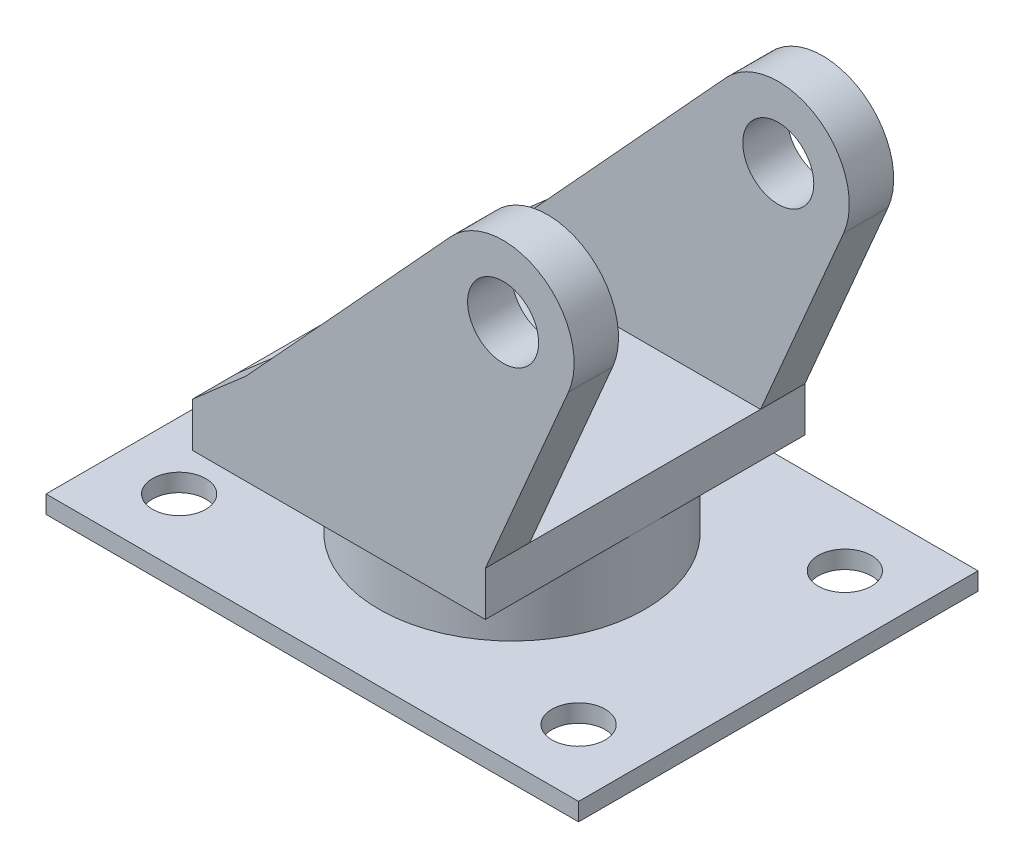
ISO-10303-21;
HEADER;
FILE_DESCRIPTION(('STEP AP214'),'2;1');
FILE_NAME('part.step','',(''),(''),'','','');
FILE_SCHEMA(('AUTOMOTIVE_DESIGN { 1 0 10303 214 1 1 1 1 }'));
ENDSEC;
DATA;
#1=APPLICATION_CONTEXT('core data for automotive mechanical design processes');
#2=APPLICATION_PROTOCOL_DEFINITION('international standard','automotive_design',2000,#1);
#3=PRODUCT_CONTEXT('',#1,'mechanical');
#4=PRODUCT('Part','Part','',(#3));
#5=PRODUCT_RELATED_PRODUCT_CATEGORY('part','',(#4));
#6=PRODUCT_DEFINITION_FORMATION('','',#4);
#7=PRODUCT_DEFINITION_CONTEXT('part definition',#1,'design');
#8=PRODUCT_DEFINITION('design','',#6,#7);
#9=PRODUCT_DEFINITION_SHAPE('','',#8);
#10=(LENGTH_UNIT() NAMED_UNIT(*) SI_UNIT(.MILLI.,.METRE.));
#11=(NAMED_UNIT(*) PLANE_ANGLE_UNIT() SI_UNIT($,.RADIAN.));
#12=(NAMED_UNIT(*) SI_UNIT($,.STERADIAN.) SOLID_ANGLE_UNIT());
#13=UNCERTAINTY_MEASURE_WITH_UNIT(LENGTH_MEASURE(1.E-05),#10,'distance_accuracy_value','');
#14=(GEOMETRIC_REPRESENTATION_CONTEXT(3) GLOBAL_UNCERTAINTY_ASSIGNED_CONTEXT((#13)) GLOBAL_UNIT_ASSIGNED_CONTEXT((#10,
#11,#12)) REPRESENTATION_CONTEXT('',''));
#15=CARTESIAN_POINT('',(0.,0.,0.));
#16=DIRECTION('',(0.,0.,1.));
#17=DIRECTION('',(1.,0.,0.));
#18=AXIS2_PLACEMENT_3D('',#15,#16,#17);
#19=CARTESIAN_POINT('',(17.0000000000009,39.9999999999992,18.));
#20=DIRECTION('',(0.,0.,-1.));
#21=DIRECTION('',(-1.,0.,0.));
#22=AXIS2_PLACEMENT_3D('',#19,#20,#21);
#23=PLANE('',#22);
#24=DIRECTION('',(-0.753353489502776,-0.65761578437108,0.));
#25=VECTOR('',#24,1.);
#26=CARTESIAN_POINT('',(-18.,14.9999999999906,18.));
#27=LINE('',#26,#25);
#28=CARTESIAN_POINT('',(-11.94409655582,20.2863068254206,18.));
#29=VERTEX_POINT('',#28);
#30=CARTESIAN_POINT('',(-18.,14.99999999999,18.));
#31=VERTEX_POINT('',#30);
#32=EDGE_CURVE('E277',#29,#31,#27,.T.);
#33=ORIENTED_EDGE('',*,*,#32,.T.);
#34=DIRECTION('',(0.,1.,0.));
#35=VECTOR('',#34,1.);
#36=CARTESIAN_POINT('',(-18.,10.,18.));
#37=LINE('',#36,#35);
#38=CARTESIAN_POINT('',(-18.,10.,18.));
#39=VERTEX_POINT('',#38);
#40=EDGE_CURVE('E175',#39,#31,#37,.T.);
#41=ORIENTED_EDGE('',*,*,#40,.F.);
#42=DIRECTION('',(-1.,0.,0.));
#43=VECTOR('',#42,1.);
#44=CARTESIAN_POINT('',(-18.,10.,18.));
#45=LINE('',#44,#43);
#46=CARTESIAN_POINT('',(15.,10.,18.));
#47=VERTEX_POINT('',#46);
#48=EDGE_CURVE('E172',#47,#39,#45,.T.);
#49=ORIENTED_EDGE('',*,*,#48,.F.);
#50=DIRECTION('',(0.,1.,0.));
#51=VECTOR('',#50,1.);
#52=CARTESIAN_POINT('',(15.,10.,18.));
#53=LINE('',#52,#51);
#54=CARTESIAN_POINT('',(15.0000000000003,14.9999999999906,18.));
#55=VERTEX_POINT('',#54);
#56=EDGE_CURVE('E252',#47,#55,#53,.T.);
#57=ORIENTED_EDGE('',*,*,#56,.T.);
#58=DIRECTION('',(-0.393544447211318,-0.919305590143527,0.));
#59=VECTOR('',#58,1.);
#60=CARTESIAN_POINT('',(24.35444472114,36.8516444222906,18.));
#61=LINE('',#60,#59);
#62=CARTESIAN_POINT('',(24.3544447211403,36.8516444222907,18.));
#63=VERTEX_POINT('',#62);
#64=EDGE_CURVE('E254',#63,#55,#61,.T.);
#65=ORIENTED_EDGE('',*,*,#64,.F.);
#66=CARTESIAN_POINT('',(17.0000000000009,39.9999999999992,18.));
#67=DIRECTION('',(0.,0.,1.));
#68=DIRECTION('',(-1.,0.,0.));
#69=AXIS2_PLACEMENT_3D('',#66,#67,#68);
#70=CIRCLE('',#69,7.99999999999895);
#71=CARTESIAN_POINT('',(11.1051828217126,45.4084314208956,18.));
#72=VERTEX_POINT('',#71);
#73=EDGE_CURVE('E273',#63,#72,#70,.T.);
#74=ORIENTED_EDGE('',*,*,#73,.T.);
#75=DIRECTION('',(-0.676053927612154,-0.73685214728613,0.));
#76=VECTOR('',#75,1.);
#77=CARTESIAN_POINT('',(-11.94409655582,20.2863068254206,18.));
#78=LINE('',#77,#76);
#79=EDGE_CURVE('E69',#72,#29,#78,.T.);
#80=ORIENTED_EDGE('',*,*,#79,.T.);
#81=EDGE_LOOP('',(#33,#41,#49,#57,#65,#74,#80));
#82=FACE_BOUND('',#81,.T.);
#83=CARTESIAN_POINT('',(17.,40.,18.));
#84=DIRECTION('',(0.,0.,1.));
#85=DIRECTION('',(1.,0.,0.));
#86=AXIS2_PLACEMENT_3D('',#83,#84,#85);
#87=CIRCLE('',#86,3.99999999999999);
#88=CARTESIAN_POINT('',(21.,40.,18.));
#89=VERTEX_POINT('',#88);
#90=EDGE_CURVE('E196',#89,#89,#87,.T.);
#91=ORIENTED_EDGE('',*,*,#90,.F.);
#92=EDGE_LOOP('',(#91));
#93=FACE_BOUND('',#92,.T.);
#94=ADVANCED_FACE('F49',(#82,#93),#23,.F.);
#95=CARTESIAN_POINT('',(14.9999999999994,0.,0.));
#96=DIRECTION('',(1.,0.,0.));
#97=DIRECTION('',(0.,0.,-1.));
#98=AXIS2_PLACEMENT_3D('',#95,#96,#97);
#99=PLANE('',#98);
#100=DIRECTION('',(0.,0.,-1.));
#101=VECTOR('',#100,1.);
#102=CARTESIAN_POINT('',(14.9999999999997,14.9999999999887,-13.));
#103=LINE('',#102,#101);
#104=CARTESIAN_POINT('',(15.,15.000000000001,-13.));
#105=VERTEX_POINT('',#104);
#106=CARTESIAN_POINT('',(15.,15.,-18.));
#107=VERTEX_POINT('',#106);
#108=EDGE_CURVE('E306',#105,#107,#103,.T.);
#109=ORIENTED_EDGE('',*,*,#108,.F.);
#110=DIRECTION('',(0.,0.,-1.));
#111=VECTOR('',#110,1.);
#112=CARTESIAN_POINT('',(15.,15.000000000001,13.));
#113=LINE('',#112,#111);
#114=CARTESIAN_POINT('',(15.,15.000000000001,13.));
#115=VERTEX_POINT('',#114);
#116=EDGE_CURVE('E210',#115,#105,#113,.T.);
#117=ORIENTED_EDGE('',*,*,#116,.F.);
#118=DIRECTION('',(0.,0.,1.));
#119=VECTOR('',#118,1.);
#120=CARTESIAN_POINT('',(15.0000000000003,14.9999999999906,13.));
#121=LINE('',#120,#119);
#122=EDGE_CURVE('E315',#115,#55,#121,.T.);
#123=ORIENTED_EDGE('',*,*,#122,.T.);
#124=ORIENTED_EDGE('',*,*,#56,.F.);
#125=DIRECTION('',(0.,0.,1.));
#126=VECTOR('',#125,1.);
#127=CARTESIAN_POINT('',(15.,10.,18.));
#128=LINE('',#127,#126);
#129=CARTESIAN_POINT('',(15.,10.,0.));
#130=VERTEX_POINT('',#129);
#131=EDGE_CURVE('E246',#130,#47,#128,.T.);
#132=ORIENTED_EDGE('',*,*,#131,.F.);
#133=CARTESIAN_POINT('',(15.,10.,-18.));
#134=VERTEX_POINT('',#133);
#135=EDGE_CURVE('E248',#134,#130,#128,.T.);
#136=ORIENTED_EDGE('',*,*,#135,.F.);
#137=DIRECTION('',(0.,-1.,0.));
#138=VECTOR('',#137,1.);
#139=CARTESIAN_POINT('',(15.,10.,-18.));
#140=LINE('',#139,#138);
#141=EDGE_CURVE('E192',#107,#134,#140,.T.);
#142=ORIENTED_EDGE('',*,*,#141,.F.);
#143=EDGE_LOOP('',(#109,#117,#123,#124,#132,#136,#142));
#144=FACE_BOUND('',#143,.T.);
#145=ADVANCED_FACE('F347',(#144),#99,.T.);
#146=CARTESIAN_POINT('',(-17.9999999999996,0.,0.));
#147=DIRECTION('',(1.,0.,0.));
#148=DIRECTION('',(0.,0.,-1.));
#149=AXIS2_PLACEMENT_3D('',#146,#147,#148);
#150=PLANE('',#149);
#151=DIRECTION('',(0.,0.,1.));
#152=VECTOR('',#151,1.);
#153=CARTESIAN_POINT('',(-18.,15.000000000001,-13.));
#154=LINE('',#153,#152);
#155=CARTESIAN_POINT('',(-18.,15.000000000001,-13.));
#156=VERTEX_POINT('',#155);
#157=CARTESIAN_POINT('',(-18.,15.000000000001,13.));
#158=VERTEX_POINT('',#157);
#159=EDGE_CURVE('E326',#156,#158,#154,.T.);
#160=ORIENTED_EDGE('',*,*,#159,.F.);
#161=DIRECTION('',(0.,0.,1.));
#162=VECTOR('',#161,1.);
#163=CARTESIAN_POINT('',(-18.0000000000012,14.9999999999887,-15.));
#164=LINE('',#163,#162);
#165=CARTESIAN_POINT('',(-18.0000000000005,15.,-18.));
#166=VERTEX_POINT('',#165);
#167=EDGE_CURVE('E182',#166,#156,#164,.T.);
#168=ORIENTED_EDGE('',*,*,#167,.F.);
#169=DIRECTION('',(0.,1.,0.));
#170=VECTOR('',#169,1.);
#171=CARTESIAN_POINT('',(-18.0000000000005,15.,-18.));
#172=LINE('',#171,#170);
#173=CARTESIAN_POINT('',(-18.,10.,-18.));
#174=VERTEX_POINT('',#173);
#175=EDGE_CURVE('E178',#174,#166,#172,.T.);
#176=ORIENTED_EDGE('',*,*,#175,.F.);
#177=DIRECTION('',(0.,0.,-1.));
#178=VECTOR('',#177,1.);
#179=CARTESIAN_POINT('',(-18.,10.,-15.));
#180=LINE('',#179,#178);
#181=EDGE_CURVE('E165',#39,#174,#180,.T.);
#182=ORIENTED_EDGE('',*,*,#181,.F.);
#183=ORIENTED_EDGE('',*,*,#40,.T.);
#184=DIRECTION('',(0.,0.,-1.));
#185=VECTOR('',#184,1.);
#186=CARTESIAN_POINT('',(-18.,14.9999999999906,18.));
#187=LINE('',#186,#185);
#188=EDGE_CURVE('E279',#31,#158,#187,.T.);
#189=ORIENTED_EDGE('',*,*,#188,.T.);
#190=EDGE_LOOP('',(#160,#168,#176,#182,#183,#189));
#191=FACE_BOUND('',#190,.T.);
#192=ADVANCED_FACE('F180',(#191),#150,.F.);
#193=CARTESIAN_POINT('',(17.0000000000009,39.9999999999992,13.));
#194=DIRECTION('',(0.,0.,-1.));
#195=DIRECTION('',(-1.,0.,0.));
#196=AXIS2_PLACEMENT_3D('',#193,#194,#195);
#197=PLANE('',#196);
#198=CARTESIAN_POINT('',(17.,40.,13.));
#199=DIRECTION('',(0.,0.,-1.));
#200=DIRECTION('',(-1.,0.,0.));
#201=AXIS2_PLACEMENT_3D('',#198,#199,#200);
#202=CIRCLE('',#201,3.99999999999999);
#203=CARTESIAN_POINT('',(13.,40.,13.));
#204=VERTEX_POINT('',#203);
#205=EDGE_CURVE('E193',#204,#204,#202,.T.);
#206=ORIENTED_EDGE('',*,*,#205,.F.);
#207=EDGE_LOOP('',(#206));
#208=FACE_BOUND('',#207,.T.);
#209=DIRECTION('',(-0.393544447211318,-0.919305590143527,0.));
#210=VECTOR('',#209,1.);
#211=CARTESIAN_POINT('',(24.35444472114,36.8516444222906,13.));
#212=LINE('',#211,#210);
#213=CARTESIAN_POINT('',(24.35444472114,36.8516444222906,13.));
#214=VERTEX_POINT('',#213);
#215=EDGE_CURVE('E257',#214,#115,#212,.T.);
#216=ORIENTED_EDGE('',*,*,#215,.T.);
#217=DIRECTION('',(1.,0.,0.));
#218=VECTOR('',#217,1.);
#219=CARTESIAN_POINT('',(-18.,15.000000000001,13.));
#220=LINE('',#219,#218);
#221=EDGE_CURVE('E229',#158,#115,#220,.T.);
#222=ORIENTED_EDGE('',*,*,#221,.F.);
#223=DIRECTION('',(-0.753353489502776,-0.65761578437108,0.));
#224=VECTOR('',#223,1.);
#225=CARTESIAN_POINT('',(-18.,14.9999999999906,13.));
#226=LINE('',#225,#224);
#227=CARTESIAN_POINT('',(-11.944096555808,20.286306825431,13.));
#228=VERTEX_POINT('',#227);
#229=EDGE_CURVE('E275',#228,#158,#226,.T.);
#230=ORIENTED_EDGE('',*,*,#229,.F.);
#231=DIRECTION('',(-0.676053927612154,-0.73685214728613,0.));
#232=VECTOR('',#231,1.);
#233=CARTESIAN_POINT('',(-11.94409655582,20.2863068254206,13.));
#234=LINE('',#233,#232);
#235=CARTESIAN_POINT('',(11.105182821735,45.40843142092,13.));
#236=VERTEX_POINT('',#235);
#237=EDGE_CURVE('E272',#236,#228,#234,.T.);
#238=ORIENTED_EDGE('',*,*,#237,.F.);
#239=CARTESIAN_POINT('',(17.0000000000009,39.9999999999992,13.));
#240=DIRECTION('',(0.,0.,1.));
#241=DIRECTION('',(-1.,0.,0.));
#242=AXIS2_PLACEMENT_3D('',#239,#240,#241);
#243=CIRCLE('',#242,7.99999999999895);
#244=EDGE_CURVE('E262',#214,#236,#243,.T.);
#245=ORIENTED_EDGE('',*,*,#244,.F.);
#246=EDGE_LOOP('',(#216,#222,#230,#238,#245));
#247=FACE_BOUND('',#246,.T.);
#248=ADVANCED_FACE('F381',(#208,#247),#197,.T.);
#249=CARTESIAN_POINT('',(17.0000000000009,39.9999999999992,18.));
#250=DIRECTION('',(0.,0.,-1.));
#251=DIRECTION('',(-1.,0.,0.));
#252=AXIS2_PLACEMENT_3D('',#249,#250,#251);
#253=CYLINDRICAL_SURFACE('',#252,7.99999999999895);
#254=DIRECTION('',(0.,0.,-1.));
#255=VECTOR('',#254,1.);
#256=CARTESIAN_POINT('',(24.3544447211403,36.8516444222907,18.));
#257=LINE('',#256,#255);
#258=EDGE_CURVE('E282',#63,#214,#257,.T.);
#259=ORIENTED_EDGE('',*,*,#258,.T.);
#260=ORIENTED_EDGE('',*,*,#244,.T.);
#261=DIRECTION('',(0.,0.,-1.));
#262=VECTOR('',#261,1.);
#263=CARTESIAN_POINT('',(11.1051828217126,45.4084314208956,18.));
#264=LINE('',#263,#262);
#265=EDGE_CURVE('E288',#72,#236,#264,.T.);
#266=ORIENTED_EDGE('',*,*,#265,.F.);
#267=ORIENTED_EDGE('',*,*,#73,.F.);
#268=EDGE_LOOP('',(#259,#260,#266,#267));
#269=FACE_BOUND('',#268,.T.);
#270=ADVANCED_FACE('F51',(#269),#253,.T.);
#271=CARTESIAN_POINT('',(-11.94409655582,20.2863068254206,18.));
#272=DIRECTION('',(0.73685214728613,-0.676053927612154,0.));
#273=DIRECTION('',(0.676053927612154,0.73685214728613,0.));
#274=AXIS2_PLACEMENT_3D('',#271,#272,#273);
#275=PLANE('',#274);
#276=ORIENTED_EDGE('',*,*,#237,.T.);
#277=DIRECTION('',(0.,0.,-1.));
#278=VECTOR('',#277,1.);
#279=CARTESIAN_POINT('',(-11.94409655582,20.2863068254206,18.));
#280=LINE('',#279,#278);
#281=EDGE_CURVE('E285',#29,#228,#280,.T.);
#282=ORIENTED_EDGE('',*,*,#281,.F.);
#283=ORIENTED_EDGE('',*,*,#79,.F.);
#284=ORIENTED_EDGE('',*,*,#265,.T.);
#285=EDGE_LOOP('',(#276,#282,#283,#284));
#286=FACE_BOUND('',#285,.T.);
#287=ADVANCED_FACE('F387',(#286),#275,.F.);
#288=CARTESIAN_POINT('',(-18.,14.9999999999906,18.));
#289=DIRECTION('',(0.65761578437108,-0.753353489502776,0.));
#290=DIRECTION('',(0.753353489502776,0.65761578437108,0.));
#291=AXIS2_PLACEMENT_3D('',#288,#289,#290);
#292=PLANE('',#291);
#293=ORIENTED_EDGE('',*,*,#229,.T.);
#294=ORIENTED_EDGE('',*,*,#188,.F.);
#295=ORIENTED_EDGE('',*,*,#32,.F.);
#296=ORIENTED_EDGE('',*,*,#281,.T.);
#297=EDGE_LOOP('',(#293,#294,#295,#296));
#298=FACE_BOUND('',#297,.T.);
#299=ADVANCED_FACE('F385',(#298),#292,.F.);
#300=CARTESIAN_POINT('',(16.9999999999952,40.0000000000021,-13.));
#301=DIRECTION('',(0.,0.,1.));
#302=DIRECTION('',(1.,0.,0.));
#303=AXIS2_PLACEMENT_3D('',#300,#301,#302);
#304=PLANE('',#303);
#305=CARTESIAN_POINT('',(17.,40.,-13.));
#306=DIRECTION('',(0.,0.,1.));
#307=DIRECTION('',(1.,0.,0.));
#308=AXIS2_PLACEMENT_3D('',#305,#306,#307);
#309=CIRCLE('',#308,3.99999999999999);
#310=CARTESIAN_POINT('',(21.,40.,-13.));
#311=VERTEX_POINT('',#310);
#312=EDGE_CURVE('E421',#311,#311,#309,.T.);
#313=ORIENTED_EDGE('',*,*,#312,.F.);
#314=EDGE_LOOP('',(#313));
#315=FACE_BOUND('',#314,.T.);
#316=CARTESIAN_POINT('',(16.9999999999952,40.0000000000021,-13.));
#317=DIRECTION('',(0.,0.,-1.));
#318=DIRECTION('',(1.,0.,0.));
#319=AXIS2_PLACEMENT_3D('',#316,#317,#318);
#320=CIRCLE('',#319,8.00000000000141);
#321=CARTESIAN_POINT('',(11.1051828217232,45.40843142092,-13.));
#322=VERTEX_POINT('',#321);
#323=CARTESIAN_POINT('',(24.35444472114,36.851644422289,-13.));
#324=VERTEX_POINT('',#323);
#325=EDGE_CURVE('E58',#322,#324,#320,.T.);
#326=ORIENTED_EDGE('',*,*,#325,.F.);
#327=DIRECTION('',(0.676053927612209,0.736852147286079,0.));
#328=VECTOR('',#327,1.);
#329=CARTESIAN_POINT('',(11.1051828217055,45.4084314209007,-13.));
#330=LINE('',#329,#328);
#331=CARTESIAN_POINT('',(-11.9440965558257,20.286306825431,-13.));
#332=VERTEX_POINT('',#331);
#333=EDGE_CURVE('E258',#332,#322,#330,.T.);
#334=ORIENTED_EDGE('',*,*,#333,.F.);
#335=DIRECTION('',(0.75335348950278,0.657615784371076,0.));
#336=VECTOR('',#335,1.);
#337=CARTESIAN_POINT('',(-11.9440965559012,20.2863068253487,-13.));
#338=LINE('',#337,#336);
#339=EDGE_CURVE('E260',#156,#332,#338,.T.);
#340=ORIENTED_EDGE('',*,*,#339,.F.);
#341=DIRECTION('',(-1.,0.,0.));
#342=VECTOR('',#341,1.);
#343=CARTESIAN_POINT('',(15.,15.000000000001,-13.));
#344=LINE('',#343,#342);
#345=EDGE_CURVE('E328',#105,#156,#344,.T.);
#346=ORIENTED_EDGE('',*,*,#345,.F.);
#347=DIRECTION('',(0.393544447211335,0.919305590143519,0.));
#348=VECTOR('',#347,1.);
#349=CARTESIAN_POINT('',(14.9999999999997,14.9999999999887,-13.));
#350=LINE('',#349,#348);
#351=EDGE_CURVE('E310',#105,#324,#350,.T.);
#352=ORIENTED_EDGE('',*,*,#351,.T.);
#353=EDGE_LOOP('',(#326,#334,#340,#346,#352));
#354=FACE_BOUND('',#353,.T.);
#355=ADVANCED_FACE('F353',(#315,#354),#304,.T.);
#356=CARTESIAN_POINT('',(-11.9440965559012,20.2863068253487,-15.));
#357=DIRECTION('',(0.657615784371076,-0.75335348950278,0.));
#358=DIRECTION('',(0.75335348950278,0.657615784371076,0.));
#359=AXIS2_PLACEMENT_3D('',#356,#357,#358);
#360=PLANE('',#359);
#361=ORIENTED_EDGE('',*,*,#339,.T.);
#362=DIRECTION('',(0.,0.,1.));
#363=VECTOR('',#362,1.);
#364=CARTESIAN_POINT('',(-11.9440965559012,20.2863068253487,-15.));
#365=LINE('',#364,#363);
#366=CARTESIAN_POINT('',(-11.9440965559005,20.28630682536,-18.));
#367=VERTEX_POINT('',#366);
#368=EDGE_CURVE('E269',#367,#332,#365,.T.);
#369=ORIENTED_EDGE('',*,*,#368,.F.);
#370=DIRECTION('',(0.75335348950278,0.657615784371075,0.));
#371=VECTOR('',#370,1.);
#372=CARTESIAN_POINT('',(-11.9440965559005,20.28630682536,-18.));
#373=LINE('',#372,#371);
#374=EDGE_CURVE('E186',#166,#367,#373,.T.);
#375=ORIENTED_EDGE('',*,*,#374,.F.);
#376=ORIENTED_EDGE('',*,*,#167,.T.);
#377=EDGE_LOOP('',(#361,#369,#375,#376));
#378=FACE_BOUND('',#377,.T.);
#379=ADVANCED_FACE('F355',(#378),#360,.F.);
#380=CARTESIAN_POINT('',(11.1051828217055,45.4084314209007,-15.));
#381=DIRECTION('',(0.736852147286079,-0.676053927612209,0.));
#382=DIRECTION('',(0.676053927612209,0.736852147286079,0.));
#383=AXIS2_PLACEMENT_3D('',#380,#381,#382);
#384=PLANE('',#383);
#385=ORIENTED_EDGE('',*,*,#333,.T.);
#386=DIRECTION('',(0.,0.,1.));
#387=VECTOR('',#386,1.);
#388=CARTESIAN_POINT('',(11.1051828217055,45.4084314209007,-15.));
#389=LINE('',#388,#387);
#390=CARTESIAN_POINT('',(11.1051828217119,45.4084314209107,-18.));
#391=VERTEX_POINT('',#390);
#392=EDGE_CURVE('E266',#391,#322,#389,.T.);
#393=ORIENTED_EDGE('',*,*,#392,.F.);
#394=DIRECTION('',(0.676053927612319,0.736852147285978,0.));
#395=VECTOR('',#394,1.);
#396=CARTESIAN_POINT('',(11.1051828217119,45.4084314209107,-18.));
#397=LINE('',#396,#395);
#398=EDGE_CURVE('E201',#367,#391,#397,.T.);
#399=ORIENTED_EDGE('',*,*,#398,.F.);
#400=ORIENTED_EDGE('',*,*,#368,.T.);
#401=EDGE_LOOP('',(#385,#393,#399,#400));
#402=FACE_BOUND('',#401,.T.);
#403=ADVANCED_FACE('F359',(#402),#384,.F.);
#404=CARTESIAN_POINT('',(16.9999999999952,40.0000000000021,-15.));
#405=DIRECTION('',(0.,0.,1.));
#406=DIRECTION('',(1.,0.,0.));
#407=AXIS2_PLACEMENT_3D('',#404,#405,#406);
#408=CYLINDRICAL_SURFACE('',#407,8.00000000000141);
#409=ORIENTED_EDGE('',*,*,#392,.T.);
#410=ORIENTED_EDGE('',*,*,#325,.T.);
#411=DIRECTION('',(0.,0.,1.));
#412=VECTOR('',#411,1.);
#413=CARTESIAN_POINT('',(24.3544447211397,36.8516444222993,-15.));
#414=LINE('',#413,#412);
#415=CARTESIAN_POINT('',(24.3544447211489,36.8516444223209,-18.));
#416=VERTEX_POINT('',#415);
#417=EDGE_CURVE('E263',#416,#324,#414,.T.);
#418=ORIENTED_EDGE('',*,*,#417,.F.);
#419=CARTESIAN_POINT('',(17.0000000000002,40.0000000000117,-18.));
#420=DIRECTION('',(0.,0.,-1.));
#421=DIRECTION('',(1.,0.,0.));
#422=AXIS2_PLACEMENT_3D('',#419,#420,#421);
#423=CIRCLE('',#422,8.00000000000061);
#424=EDGE_CURVE('E204',#391,#416,#423,.T.);
#425=ORIENTED_EDGE('',*,*,#424,.F.);
#426=EDGE_LOOP('',(#409,#410,#418,#425));
#427=FACE_BOUND('',#426,.T.);
#428=ADVANCED_FACE('F361',(#427),#408,.T.);
#429=CARTESIAN_POINT('',(14.9999999999997,14.9999999999887,-13.));
#430=DIRECTION('',(-0.91930559014352,0.393544447211335,0.));
#431=DIRECTION('',(-0.393544447211335,-0.91930559014352,0.));
#432=AXIS2_PLACEMENT_3D('',#429,#430,#431);
#433=PLANE('',#432);
#434=ORIENTED_EDGE('',*,*,#108,.T.);
#435=DIRECTION('',(-0.393544447211328,-0.919305590143522,0.));
#436=VECTOR('',#435,1.);
#437=CARTESIAN_POINT('',(15.,15.,-18.));
#438=LINE('',#437,#436);
#439=EDGE_CURVE('E207',#416,#107,#438,.T.);
#440=ORIENTED_EDGE('',*,*,#439,.F.);
#441=ORIENTED_EDGE('',*,*,#417,.T.);
#442=ORIENTED_EDGE('',*,*,#351,.F.);
#443=EDGE_LOOP('',(#434,#440,#441,#442));
#444=FACE_BOUND('',#443,.T.);
#445=ADVANCED_FACE('F350',(#444),#433,.F.);
#446=CARTESIAN_POINT('',(24.35444472114,36.8516444222906,13.));
#447=DIRECTION('',(-0.919305590143527,0.393544447211318,0.));
#448=DIRECTION('',(-0.393544447211318,-0.919305590143527,0.));
#449=AXIS2_PLACEMENT_3D('',#446,#447,#448);
#450=PLANE('',#449);
#451=ORIENTED_EDGE('',*,*,#64,.T.);
#452=ORIENTED_EDGE('',*,*,#122,.F.);
#453=ORIENTED_EDGE('',*,*,#215,.F.);
#454=ORIENTED_EDGE('',*,*,#258,.F.);
#455=EDGE_LOOP('',(#451,#452,#453,#454));
#456=FACE_BOUND('',#455,.T.);
#457=ADVANCED_FACE('F368',(#456),#450,.F.);
#458=CARTESIAN_POINT('',(0.,10.,0.));
#459=DIRECTION('',(0.,1.,0.));
#460=DIRECTION('',(0.,0.,1.));
#461=AXIS2_PLACEMENT_3D('',#458,#459,#460);
#462=PLANE('',#461);
#463=CARTESIAN_POINT('',(0.,10.,0.));
#464=DIRECTION('',(0.,-1.,0.));
#465=DIRECTION('',(0.,0.,-1.));
#466=AXIS2_PLACEMENT_3D('',#463,#464,#465);
#467=CIRCLE('',#466,15.);
#468=EDGE_CURVE('E12',#130,#130,#467,.T.);
#469=ORIENTED_EDGE('',*,*,#468,.F.);
#470=ORIENTED_EDGE('',*,*,#131,.T.);
#471=ORIENTED_EDGE('',*,*,#48,.T.);
#472=ORIENTED_EDGE('',*,*,#181,.T.);
#473=DIRECTION('',(-1.,0.,0.));
#474=VECTOR('',#473,1.);
#475=CARTESIAN_POINT('',(-18.,10.,-18.));
#476=LINE('',#475,#474);
#477=EDGE_CURVE('E170',#134,#174,#476,.T.);
#478=ORIENTED_EDGE('',*,*,#477,.F.);
#479=ORIENTED_EDGE('',*,*,#135,.T.);
#480=EDGE_LOOP('',(#469,#470,#471,#472,#478,#479));
#481=FACE_BOUND('',#480,.T.);
#482=ADVANCED_FACE('F167',(#481),#462,.F.);
#483=CARTESIAN_POINT('',(0.,2.,0.));
#484=DIRECTION('',(0.,1.,0.));
#485=DIRECTION('',(0.,0.,1.));
#486=AXIS2_PLACEMENT_3D('',#483,#484,#485);
#487=CYLINDRICAL_SURFACE('',#486,15.);
#488=CARTESIAN_POINT('',(0.,2.,0.));
#489=DIRECTION('',(0.,-1.,0.));
#490=DIRECTION('',(0.,0.,-1.));
#491=AXIS2_PLACEMENT_3D('',#488,#489,#490);
#492=CIRCLE('',#491,15.);
#493=CARTESIAN_POINT('',(0.,2.,-15.));
#494=VERTEX_POINT('',#493);
#495=EDGE_CURVE('E239',#494,#494,#492,.T.);
#496=ORIENTED_EDGE('',*,*,#495,.F.);
#497=EDGE_LOOP('',(#496));
#498=FACE_BOUND('',#497,.T.);
#499=ORIENTED_EDGE('',*,*,#468,.T.);
#500=EDGE_LOOP('',(#499));
#501=FACE_BOUND('',#500,.T.);
#502=ADVANCED_FACE('F411',(#498,#501),#487,.T.);
#503=CARTESIAN_POINT('',(-30.,0.,-22.5));
#504=DIRECTION('',(-1.,0.,0.));
#505=DIRECTION('',(0.,0.,1.));
#506=AXIS2_PLACEMENT_3D('',#503,#504,#505);
#507=PLANE('',#506);
#508=DIRECTION('',(0.,0.,1.));
#509=VECTOR('',#508,1.);
#510=CARTESIAN_POINT('',(-30.,2.,-22.5));
#511=LINE('',#510,#509);
#512=CARTESIAN_POINT('',(-30.,2.,-22.5));
#513=VERTEX_POINT('',#512);
#514=CARTESIAN_POINT('',(-30.,2.,22.5));
#515=VERTEX_POINT('',#514);
#516=EDGE_CURVE('E225',#513,#515,#511,.T.);
#517=ORIENTED_EDGE('',*,*,#516,.F.);
#518=DIRECTION('',(0.,1.,0.));
#519=VECTOR('',#518,1.);
#520=CARTESIAN_POINT('',(-30.,0.,-22.5));
#521=LINE('',#520,#519);
#522=CARTESIAN_POINT('',(-30.,0.,-22.5));
#523=VERTEX_POINT('',#522);
#524=EDGE_CURVE('E237',#523,#513,#521,.T.);
#525=ORIENTED_EDGE('',*,*,#524,.F.);
#526=DIRECTION('',(0.,0.,1.));
#527=VECTOR('',#526,1.);
#528=CARTESIAN_POINT('',(-30.,0.,-22.5));
#529=LINE('',#528,#527);
#530=CARTESIAN_POINT('',(-30.,0.,22.5));
#531=VERTEX_POINT('',#530);
#532=EDGE_CURVE('E211',#523,#531,#529,.T.);
#533=ORIENTED_EDGE('',*,*,#532,.T.);
#534=DIRECTION('',(0.,1.,0.));
#535=VECTOR('',#534,1.);
#536=CARTESIAN_POINT('',(-30.,0.,22.5));
#537=LINE('',#536,#535);
#538=EDGE_CURVE('E224',#531,#515,#537,.T.);
#539=ORIENTED_EDGE('',*,*,#538,.T.);
#540=EDGE_LOOP('',(#517,#525,#533,#539));
#541=FACE_BOUND('',#540,.T.);
#542=ADVANCED_FACE('F466',(#541),#507,.T.);
#543=CARTESIAN_POINT('',(30.,0.,-22.5));
#544=DIRECTION('',(0.,0.,-1.));
#545=DIRECTION('',(-1.,0.,0.));
#546=AXIS2_PLACEMENT_3D('',#543,#544,#545);
#547=PLANE('',#546);
#548=DIRECTION('',(-1.,0.,0.));
#549=VECTOR('',#548,1.);
#550=CARTESIAN_POINT('',(30.,2.,-22.5));
#551=LINE('',#550,#549);
#552=CARTESIAN_POINT('',(30.,2.,-22.5));
#553=VERTEX_POINT('',#552);
#554=EDGE_CURVE('E215',#553,#513,#551,.T.);
#555=ORIENTED_EDGE('',*,*,#554,.F.);
#556=DIRECTION('',(0.,1.,0.));
#557=VECTOR('',#556,1.);
#558=CARTESIAN_POINT('',(30.,0.,-22.5));
#559=LINE('',#558,#557);
#560=CARTESIAN_POINT('',(30.,0.,-22.5));
#561=VERTEX_POINT('',#560);
#562=EDGE_CURVE('E240',#561,#553,#559,.T.);
#563=ORIENTED_EDGE('',*,*,#562,.F.);
#564=DIRECTION('',(-1.,0.,0.));
#565=VECTOR('',#564,1.);
#566=CARTESIAN_POINT('',(30.,0.,-22.5));
#567=LINE('',#566,#565);
#568=EDGE_CURVE('E221',#561,#523,#567,.T.);
#569=ORIENTED_EDGE('',*,*,#568,.T.);
#570=ORIENTED_EDGE('',*,*,#524,.T.);
#571=EDGE_LOOP('',(#555,#563,#569,#570));
#572=FACE_BOUND('',#571,.T.);
#573=ADVANCED_FACE('F462',(#572),#547,.T.);
#574=CARTESIAN_POINT('',(30.,0.,22.5));
#575=DIRECTION('',(1.,0.,0.));
#576=DIRECTION('',(0.,0.,-1.));
#577=AXIS2_PLACEMENT_3D('',#574,#575,#576);
#578=PLANE('',#577);
#579=DIRECTION('',(0.,0.,-1.));
#580=VECTOR('',#579,1.);
#581=CARTESIAN_POINT('',(30.,2.,22.5));
#582=LINE('',#581,#580);
#583=CARTESIAN_POINT('',(30.,2.,22.5));
#584=VERTEX_POINT('',#583);
#585=EDGE_CURVE('E232',#584,#553,#582,.T.);
#586=ORIENTED_EDGE('',*,*,#585,.F.);
#587=DIRECTION('',(0.,1.,0.));
#588=VECTOR('',#587,1.);
#589=CARTESIAN_POINT('',(30.,0.,22.5));
#590=LINE('',#589,#588);
#591=CARTESIAN_POINT('',(30.,0.,22.5));
#592=VERTEX_POINT('',#591);
#593=EDGE_CURVE('E242',#592,#584,#590,.T.);
#594=ORIENTED_EDGE('',*,*,#593,.F.);
#595=DIRECTION('',(0.,0.,-1.));
#596=VECTOR('',#595,1.);
#597=CARTESIAN_POINT('',(30.,0.,22.5));
#598=LINE('',#597,#596);
#599=EDGE_CURVE('E218',#592,#561,#598,.T.);
#600=ORIENTED_EDGE('',*,*,#599,.T.);
#601=ORIENTED_EDGE('',*,*,#562,.T.);
#602=EDGE_LOOP('',(#586,#594,#600,#601));
#603=FACE_BOUND('',#602,.T.);
#604=ADVANCED_FACE('F465',(#603),#578,.T.);
#605=CARTESIAN_POINT('',(-30.,0.,22.5));
#606=DIRECTION('',(0.,0.,1.));
#607=DIRECTION('',(1.,0.,0.));
#608=AXIS2_PLACEMENT_3D('',#605,#606,#607);
#609=PLANE('',#608);
#610=DIRECTION('',(1.,0.,0.));
#611=VECTOR('',#610,1.);
#612=CARTESIAN_POINT('',(-30.,2.,22.5));
#613=LINE('',#612,#611);
#614=EDGE_CURVE('E228',#515,#584,#613,.T.);
#615=ORIENTED_EDGE('',*,*,#614,.F.);
#616=ORIENTED_EDGE('',*,*,#538,.F.);
#617=DIRECTION('',(1.,0.,0.));
#618=VECTOR('',#617,1.);
#619=CARTESIAN_POINT('',(-30.,0.,22.5));
#620=LINE('',#619,#618);
#621=EDGE_CURVE('E214',#531,#592,#620,.T.);
#622=ORIENTED_EDGE('',*,*,#621,.T.);
#623=ORIENTED_EDGE('',*,*,#593,.T.);
#624=EDGE_LOOP('',(#615,#616,#622,#623));
#625=FACE_BOUND('',#624,.T.);
#626=ADVANCED_FACE('F457',(#625),#609,.T.);
#627=CARTESIAN_POINT('',(0.,0.,0.));
#628=DIRECTION('',(0.,1.,0.));
#629=DIRECTION('',(0.,0.,1.));
#630=AXIS2_PLACEMENT_3D('',#627,#628,#629);
#631=PLANE('',#630);
#632=CARTESIAN_POINT('',(-22.5,0.,15.));
#633=DIRECTION('',(0.,-1.,0.));
#634=DIRECTION('',(0.,0.,-1.));
#635=AXIS2_PLACEMENT_3D('',#632,#633,#634);
#636=CIRCLE('',#635,2.99999999999999);
#637=CARTESIAN_POINT('',(-22.5,0.,12.));
#638=VERTEX_POINT('',#637);
#639=EDGE_CURVE('E780',#638,#638,#636,.T.);
#640=ORIENTED_EDGE('',*,*,#639,.F.);
#641=EDGE_LOOP('',(#640));
#642=FACE_BOUND('',#641,.T.);
#643=CARTESIAN_POINT('',(22.5,0.,15.));
#644=DIRECTION('',(0.,1.,0.));
#645=DIRECTION('',(0.,0.,1.));
#646=AXIS2_PLACEMENT_3D('',#643,#644,#645);
#647=CIRCLE('',#646,2.99999999999999);
#648=CARTESIAN_POINT('',(22.5,0.,18.));
#649=VERTEX_POINT('',#648);
#650=EDGE_CURVE('E786',#649,#649,#647,.T.);
#651=ORIENTED_EDGE('',*,*,#650,.T.);
#652=EDGE_LOOP('',(#651));
#653=FACE_BOUND('',#652,.T.);
#654=CARTESIAN_POINT('',(-22.5,0.,-15.));
#655=DIRECTION('',(0.,1.,0.));
#656=DIRECTION('',(0.,0.,1.));
#657=AXIS2_PLACEMENT_3D('',#654,#655,#656);
#658=CIRCLE('',#657,2.99999999999999);
#659=CARTESIAN_POINT('',(-22.5,0.,-12.));
#660=VERTEX_POINT('',#659);
#661=EDGE_CURVE('E792',#660,#660,#658,.T.);
#662=ORIENTED_EDGE('',*,*,#661,.T.);
#663=EDGE_LOOP('',(#662));
#664=FACE_BOUND('',#663,.T.);
#665=CARTESIAN_POINT('',(22.5,0.,-15.));
#666=DIRECTION('',(0.,-1.,0.));
#667=DIRECTION('',(0.,0.,-1.));
#668=AXIS2_PLACEMENT_3D('',#665,#666,#667);
#669=CIRCLE('',#668,2.99999999999999);
#670=CARTESIAN_POINT('',(22.5,0.,-18.));
#671=VERTEX_POINT('',#670);
#672=EDGE_CURVE('E429',#671,#671,#669,.T.);
#673=ORIENTED_EDGE('',*,*,#672,.F.);
#674=EDGE_LOOP('',(#673));
#675=FACE_BOUND('',#674,.T.);
#676=ORIENTED_EDGE('',*,*,#532,.F.);
#677=ORIENTED_EDGE('',*,*,#568,.F.);
#678=ORIENTED_EDGE('',*,*,#599,.F.);
#679=ORIENTED_EDGE('',*,*,#621,.F.);
#680=EDGE_LOOP('',(#676,#677,#678,#679));
#681=FACE_BOUND('',#680,.T.);
#682=ADVANCED_FACE('F454',(#642,#653,#664,#675,#681),#631,.F.);
#683=CARTESIAN_POINT('',(0.,2.,0.));
#684=DIRECTION('',(0.,1.,0.));
#685=DIRECTION('',(0.,0.,1.));
#686=AXIS2_PLACEMENT_3D('',#683,#684,#685);
#687=PLANE('',#686);
#688=CARTESIAN_POINT('',(-22.5,2.,15.));
#689=DIRECTION('',(0.,1.,0.));
#690=DIRECTION('',(0.,0.,1.));
#691=AXIS2_PLACEMENT_3D('',#688,#689,#690);
#692=CIRCLE('',#691,2.99999999999999);
#693=CARTESIAN_POINT('',(-22.5,2.,18.));
#694=VERTEX_POINT('',#693);
#695=EDGE_CURVE('E53',#694,#694,#692,.T.);
#696=ORIENTED_EDGE('',*,*,#695,.F.);
#697=EDGE_LOOP('',(#696));
#698=FACE_BOUND('',#697,.T.);
#699=CARTESIAN_POINT('',(22.5,2.,15.));
#700=DIRECTION('',(0.,1.,0.));
#701=DIRECTION('',(0.,0.,1.));
#702=AXIS2_PLACEMENT_3D('',#699,#700,#701);
#703=CIRCLE('',#702,2.99999999999999);
#704=CARTESIAN_POINT('',(22.5,2.,18.));
#705=VERTEX_POINT('',#704);
#706=EDGE_CURVE('E782',#705,#705,#703,.T.);
#707=ORIENTED_EDGE('',*,*,#706,.F.);
#708=EDGE_LOOP('',(#707));
#709=FACE_BOUND('',#708,.T.);
#710=CARTESIAN_POINT('',(-22.5,2.,-15.));
#711=DIRECTION('',(0.,1.,0.));
#712=DIRECTION('',(0.,0.,1.));
#713=AXIS2_PLACEMENT_3D('',#710,#711,#712);
#714=CIRCLE('',#713,2.99999999999999);
#715=CARTESIAN_POINT('',(-22.5,2.,-12.));
#716=VERTEX_POINT('',#715);
#717=EDGE_CURVE('E789',#716,#716,#714,.T.);
#718=ORIENTED_EDGE('',*,*,#717,.F.);
#719=EDGE_LOOP('',(#718));
#720=FACE_BOUND('',#719,.T.);
#721=CARTESIAN_POINT('',(22.5,2.,-15.));
#722=DIRECTION('',(0.,1.,0.));
#723=DIRECTION('',(0.,0.,1.));
#724=AXIS2_PLACEMENT_3D('',#721,#722,#723);
#725=CIRCLE('',#724,2.99999999999999);
#726=CARTESIAN_POINT('',(22.5,2.,-12.));
#727=VERTEX_POINT('',#726);
#728=EDGE_CURVE('E424',#727,#727,#725,.T.);
#729=ORIENTED_EDGE('',*,*,#728,.F.);
#730=EDGE_LOOP('',(#729));
#731=FACE_BOUND('',#730,.T.);
#732=ORIENTED_EDGE('',*,*,#495,.T.);
#733=EDGE_LOOP('',(#732));
#734=FACE_BOUND('',#733,.T.);
#735=ORIENTED_EDGE('',*,*,#516,.T.);
#736=ORIENTED_EDGE('',*,*,#614,.T.);
#737=ORIENTED_EDGE('',*,*,#585,.T.);
#738=ORIENTED_EDGE('',*,*,#554,.T.);
#739=EDGE_LOOP('',(#735,#736,#737,#738));
#740=FACE_BOUND('',#739,.T.);
#741=ADVANCED_FACE('F453',(#698,#709,#720,#731,#734,#740),#687,.T.);
#742=CARTESIAN_POINT('',(0.,15.000000000001,0.));
#743=DIRECTION('',(0.,1.,0.));
#744=DIRECTION('',(0.,0.,1.));
#745=AXIS2_PLACEMENT_3D('',#742,#743,#744);
#746=PLANE('',#745);
#747=ORIENTED_EDGE('',*,*,#116,.T.);
#748=ORIENTED_EDGE('',*,*,#345,.T.);
#749=ORIENTED_EDGE('',*,*,#159,.T.);
#750=ORIENTED_EDGE('',*,*,#221,.T.);
#751=EDGE_LOOP('',(#747,#748,#749,#750));
#752=FACE_BOUND('',#751,.T.);
#753=ADVANCED_FACE('F343',(#752),#746,.T.);
#754=CARTESIAN_POINT('',(17.0000000000002,40.0000000000117,-18.));
#755=DIRECTION('',(0.,0.,1.));
#756=DIRECTION('',(1.,0.,0.));
#757=AXIS2_PLACEMENT_3D('',#754,#755,#756);
#758=PLANE('',#757);
#759=CARTESIAN_POINT('',(17.,40.,-18.));
#760=DIRECTION('',(0.,0.,1.));
#761=DIRECTION('',(1.,0.,0.));
#762=AXIS2_PLACEMENT_3D('',#759,#760,#761);
#763=CIRCLE('',#762,3.99999999999999);
#764=CARTESIAN_POINT('',(21.,40.,-18.));
#765=VERTEX_POINT('',#764);
#766=EDGE_CURVE('E423',#765,#765,#763,.T.);
#767=ORIENTED_EDGE('',*,*,#766,.T.);
#768=EDGE_LOOP('',(#767));
#769=FACE_BOUND('',#768,.T.);
#770=ORIENTED_EDGE('',*,*,#477,.T.);
#771=ORIENTED_EDGE('',*,*,#175,.T.);
#772=ORIENTED_EDGE('',*,*,#374,.T.);
#773=ORIENTED_EDGE('',*,*,#398,.T.);
#774=ORIENTED_EDGE('',*,*,#424,.T.);
#775=ORIENTED_EDGE('',*,*,#439,.T.);
#776=ORIENTED_EDGE('',*,*,#141,.T.);
#777=EDGE_LOOP('',(#770,#771,#772,#773,#774,#775,#776));
#778=FACE_BOUND('',#777,.T.);
#779=ADVANCED_FACE('F189',(#769,#778),#758,.F.);
#780=CARTESIAN_POINT('',(17.,40.,18.));
#781=DIRECTION('',(0.,0.,1.));
#782=DIRECTION('',(1.,0.,0.));
#783=AXIS2_PLACEMENT_3D('',#780,#781,#782);
#784=CYLINDRICAL_SURFACE('',#783,3.99999999999999);
#785=ORIENTED_EDGE('',*,*,#90,.T.);
#786=EDGE_LOOP('',(#785));
#787=FACE_BOUND('',#786,.T.);
#788=ORIENTED_EDGE('',*,*,#205,.T.);
#789=EDGE_LOOP('',(#788));
#790=FACE_BOUND('',#789,.T.);
#791=ADVANCED_FACE('F435',(#787,#790),#784,.F.);
#792=CARTESIAN_POINT('',(17.,40.,-13.));
#793=DIRECTION('',(0.,0.,1.));
#794=DIRECTION('',(1.,0.,0.));
#795=AXIS2_PLACEMENT_3D('',#792,#793,#794);
#796=CYLINDRICAL_SURFACE('',#795,3.99999999999999);
#797=ORIENTED_EDGE('',*,*,#312,.T.);
#798=EDGE_LOOP('',(#797));
#799=FACE_BOUND('',#798,.T.);
#800=ORIENTED_EDGE('',*,*,#766,.F.);
#801=EDGE_LOOP('',(#800));
#802=FACE_BOUND('',#801,.T.);
#803=ADVANCED_FACE('F438',(#799,#802),#796,.F.);
#804=CARTESIAN_POINT('',(22.5,0.,-15.));
#805=DIRECTION('',(0.,-1.,0.));
#806=DIRECTION('',(0.,0.,-1.));
#807=AXIS2_PLACEMENT_3D('',#804,#805,#806);
#808=CYLINDRICAL_SURFACE('',#807,2.99999999999999);
#809=ORIENTED_EDGE('',*,*,#672,.T.);
#810=EDGE_LOOP('',(#809));
#811=FACE_BOUND('',#810,.T.);
#812=ORIENTED_EDGE('',*,*,#728,.T.);
#813=EDGE_LOOP('',(#812));
#814=FACE_BOUND('',#813,.T.);
#815=ADVANCED_FACE('F445',(#811,#814),#808,.F.);
#816=CARTESIAN_POINT('',(-22.5,2.,-15.));
#817=DIRECTION('',(0.,1.,0.));
#818=DIRECTION('',(0.,0.,1.));
#819=AXIS2_PLACEMENT_3D('',#816,#817,#818);
#820=CYLINDRICAL_SURFACE('',#819,2.99999999999999);
#821=ORIENTED_EDGE('',*,*,#661,.F.);
#822=EDGE_LOOP('',(#821));
#823=FACE_BOUND('',#822,.T.);
#824=ORIENTED_EDGE('',*,*,#717,.T.);
#825=EDGE_LOOP('',(#824));
#826=FACE_BOUND('',#825,.T.);
#827=ADVANCED_FACE('F650',(#823,#826),#820,.F.);
#828=CARTESIAN_POINT('',(22.5,2.,15.));
#829=DIRECTION('',(0.,1.,0.));
#830=DIRECTION('',(0.,0.,1.));
#831=AXIS2_PLACEMENT_3D('',#828,#829,#830);
#832=CYLINDRICAL_SURFACE('',#831,2.99999999999999);
#833=ORIENTED_EDGE('',*,*,#650,.F.);
#834=EDGE_LOOP('',(#833));
#835=FACE_BOUND('',#834,.T.);
#836=ORIENTED_EDGE('',*,*,#706,.T.);
#837=EDGE_LOOP('',(#836));
#838=FACE_BOUND('',#837,.T.);
#839=ADVANCED_FACE('F660',(#835,#838),#832,.F.);
#840=CARTESIAN_POINT('',(-22.5,0.,15.));
#841=DIRECTION('',(0.,-1.,0.));
#842=DIRECTION('',(0.,0.,-1.));
#843=AXIS2_PLACEMENT_3D('',#840,#841,#842);
#844=CYLINDRICAL_SURFACE('',#843,2.99999999999999);
#845=ORIENTED_EDGE('',*,*,#695,.T.);
#846=EDGE_LOOP('',(#845));
#847=FACE_BOUND('',#846,.T.);
#848=ORIENTED_EDGE('',*,*,#639,.T.);
#849=EDGE_LOOP('',(#848));
#850=FACE_BOUND('',#849,.T.);
#851=ADVANCED_FACE('F671',(#847,#850),#844,.F.);
#852=CLOSED_SHELL('',(#94,#145,#192,#248,#270,#287,#299,#355,#379,#403,#428,#445,#457,#482,#502,
#542,#573,#604,#626,#682,#741,#753,#779,#791,#803,#815,#827,#839,#851));
#853=MANIFOLD_SOLID_BREP('B2',#852);
#854=ADVANCED_BREP_SHAPE_REPRESENTATION('',(#18,#853),#14);
#855=SHAPE_DEFINITION_REPRESENTATION(#9,#854);
ENDSEC;
END-ISO-10303-21;
